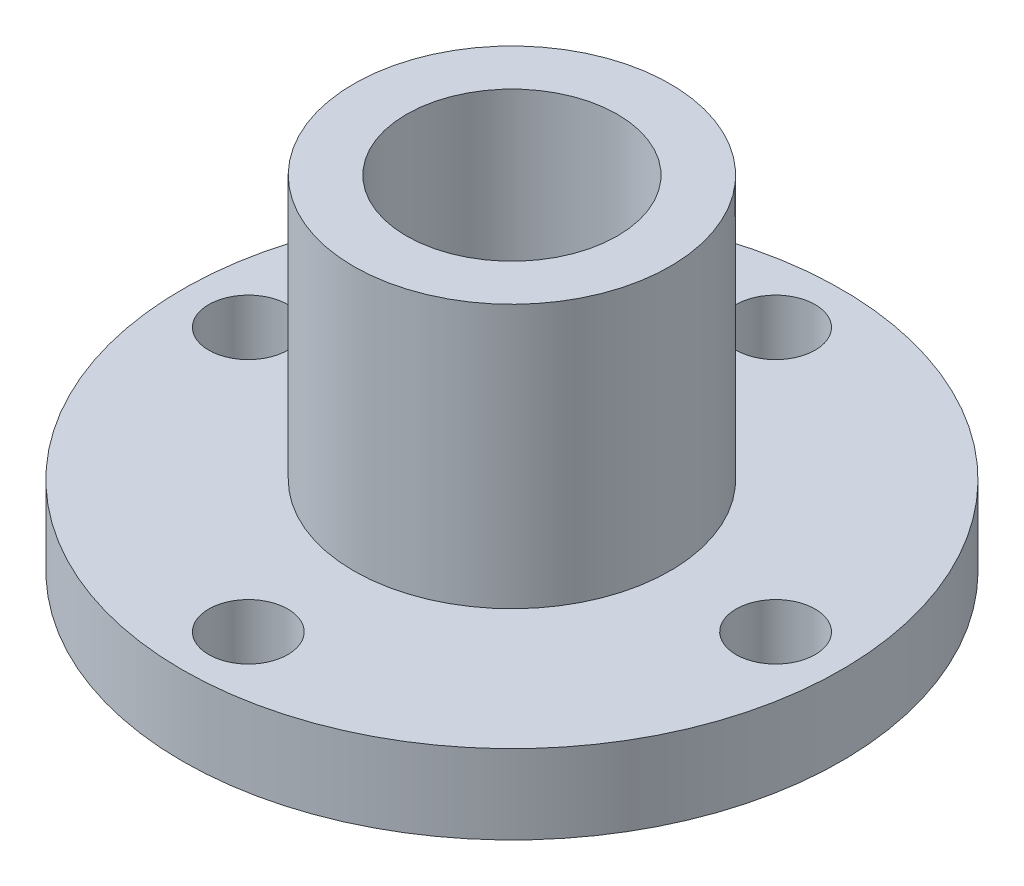
ISO-10303-21;
HEADER;
FILE_DESCRIPTION(('STEP AP214'),'2;1');
FILE_NAME('part.step','',(''),(''),'','','');
FILE_SCHEMA(('AUTOMOTIVE_DESIGN { 1 0 10303 214 1 1 1 1 }'));
ENDSEC;
DATA;
#1=APPLICATION_CONTEXT('core data for automotive mechanical design processes');
#2=APPLICATION_PROTOCOL_DEFINITION('international standard','automotive_design',2000,#1);
#3=PRODUCT_CONTEXT('',#1,'mechanical');
#4=PRODUCT('Part','Part','',(#3));
#5=PRODUCT_RELATED_PRODUCT_CATEGORY('part','',(#4));
#6=PRODUCT_DEFINITION_FORMATION('','',#4);
#7=PRODUCT_DEFINITION_CONTEXT('part definition',#1,'design');
#8=PRODUCT_DEFINITION('design','',#6,#7);
#9=PRODUCT_DEFINITION_SHAPE('','',#8);
#10=(LENGTH_UNIT() NAMED_UNIT(*) SI_UNIT(.MILLI.,.METRE.));
#11=(NAMED_UNIT(*) PLANE_ANGLE_UNIT() SI_UNIT($,.RADIAN.));
#12=(NAMED_UNIT(*) SI_UNIT($,.STERADIAN.) SOLID_ANGLE_UNIT());
#13=UNCERTAINTY_MEASURE_WITH_UNIT(LENGTH_MEASURE(1.E-05),#10,'distance_accuracy_value','');
#14=(GEOMETRIC_REPRESENTATION_CONTEXT(3) GLOBAL_UNCERTAINTY_ASSIGNED_CONTEXT((#13)) GLOBAL_UNIT_ASSIGNED_CONTEXT((#10,
#11,#12)) REPRESENTATION_CONTEXT('',''));
#15=CARTESIAN_POINT('',(0.,0.,0.));
#16=DIRECTION('',(0.,0.,1.));
#17=DIRECTION('',(1.,0.,0.));
#18=AXIS2_PLACEMENT_3D('',#15,#16,#17);
#19=CARTESIAN_POINT('',(0.,3.,0.));
#20=DIRECTION('',(0.,-1.,0.));
#21=DIRECTION('',(0.,0.,-1.));
#22=AXIS2_PLACEMENT_3D('',#19,#20,#21);
#23=CYLINDRICAL_SURFACE('',#22,12.5);
#24=CARTESIAN_POINT('',(0.,3.,0.));
#25=DIRECTION('',(0.,1.,0.));
#26=DIRECTION('',(0.,0.,1.));
#27=AXIS2_PLACEMENT_3D('',#24,#25,#26);
#28=CIRCLE('',#27,12.5);
#29=CARTESIAN_POINT('',(0.,3.,12.5));
#30=VERTEX_POINT('',#29);
#31=EDGE_CURVE('E10',#30,#30,#28,.T.);
#32=ORIENTED_EDGE('',*,*,#31,.F.);
#33=EDGE_LOOP('',(#32));
#34=FACE_BOUND('',#33,.T.);
#35=CARTESIAN_POINT('',(0.,0.,0.));
#36=DIRECTION('',(0.,1.,0.));
#37=DIRECTION('',(0.,0.,1.));
#38=AXIS2_PLACEMENT_3D('',#35,#36,#37);
#39=CIRCLE('',#38,12.5);
#40=CARTESIAN_POINT('',(0.,0.,12.5));
#41=VERTEX_POINT('',#40);
#42=EDGE_CURVE('E61',#41,#41,#39,.T.);
#43=ORIENTED_EDGE('',*,*,#42,.T.);
#44=EDGE_LOOP('',(#43));
#45=FACE_BOUND('',#44,.T.);
#46=ADVANCED_FACE('F32',(#34,#45),#23,.T.);
#47=CARTESIAN_POINT('',(0.,3.,-10.));
#48=DIRECTION('',(0.,-1.,0.));
#49=DIRECTION('',(0.,0.,-1.));
#50=AXIS2_PLACEMENT_3D('',#47,#48,#49);
#51=CYLINDRICAL_SURFACE('',#50,1.5);
#52=CARTESIAN_POINT('',(0.,3.,-10.));
#53=DIRECTION('',(0.,1.,0.));
#54=DIRECTION('',(0.,0.,1.));
#55=AXIS2_PLACEMENT_3D('',#52,#53,#54);
#56=CIRCLE('',#55,1.5);
#57=CARTESIAN_POINT('',(0.,3.,-8.5));
#58=VERTEX_POINT('',#57);
#59=EDGE_CURVE('E40',#58,#58,#56,.T.);
#60=ORIENTED_EDGE('',*,*,#59,.T.);
#61=EDGE_LOOP('',(#60));
#62=FACE_BOUND('',#61,.T.);
#63=CARTESIAN_POINT('',(0.,0.,-10.));
#64=DIRECTION('',(0.,1.,0.));
#65=DIRECTION('',(0.,0.,1.));
#66=AXIS2_PLACEMENT_3D('',#63,#64,#65);
#67=CIRCLE('',#66,1.5);
#68=CARTESIAN_POINT('',(0.,0.,-8.5));
#69=VERTEX_POINT('',#68);
#70=EDGE_CURVE('E59',#69,#69,#67,.T.);
#71=ORIENTED_EDGE('',*,*,#70,.F.);
#72=EDGE_LOOP('',(#71));
#73=FACE_BOUND('',#72,.T.);
#74=ADVANCED_FACE('F94',(#62,#73),#51,.F.);
#75=CARTESIAN_POINT('',(10.,3.,0.));
#76=DIRECTION('',(0.,-1.,0.));
#77=DIRECTION('',(0.,0.,-1.));
#78=AXIS2_PLACEMENT_3D('',#75,#76,#77);
#79=CYLINDRICAL_SURFACE('',#78,1.5);
#80=CARTESIAN_POINT('',(10.,3.,0.));
#81=DIRECTION('',(0.,1.,0.));
#82=DIRECTION('',(0.,0.,1.));
#83=AXIS2_PLACEMENT_3D('',#80,#81,#82);
#84=CIRCLE('',#83,1.5);
#85=CARTESIAN_POINT('',(10.,3.,1.5));
#86=VERTEX_POINT('',#85);
#87=EDGE_CURVE('E45',#86,#86,#84,.T.);
#88=ORIENTED_EDGE('',*,*,#87,.T.);
#89=EDGE_LOOP('',(#88));
#90=FACE_BOUND('',#89,.T.);
#91=CARTESIAN_POINT('',(10.,0.,0.));
#92=DIRECTION('',(0.,1.,0.));
#93=DIRECTION('',(0.,0.,1.));
#94=AXIS2_PLACEMENT_3D('',#91,#92,#93);
#95=CIRCLE('',#94,1.5);
#96=CARTESIAN_POINT('',(10.,0.,1.5));
#97=VERTEX_POINT('',#96);
#98=EDGE_CURVE('E56',#97,#97,#95,.T.);
#99=ORIENTED_EDGE('',*,*,#98,.F.);
#100=EDGE_LOOP('',(#99));
#101=FACE_BOUND('',#100,.T.);
#102=ADVANCED_FACE('F82',(#90,#101),#79,.F.);
#103=CARTESIAN_POINT('',(0.,3.,10.));
#104=DIRECTION('',(0.,-1.,0.));
#105=DIRECTION('',(0.,0.,-1.));
#106=AXIS2_PLACEMENT_3D('',#103,#104,#105);
#107=CYLINDRICAL_SURFACE('',#106,1.5);
#108=CARTESIAN_POINT('',(0.,3.,10.));
#109=DIRECTION('',(0.,1.,0.));
#110=DIRECTION('',(0.,0.,1.));
#111=AXIS2_PLACEMENT_3D('',#108,#109,#110);
#112=CIRCLE('',#111,1.5);
#113=CARTESIAN_POINT('',(0.,3.,11.5));
#114=VERTEX_POINT('',#113);
#115=EDGE_CURVE('E70',#114,#114,#112,.T.);
#116=ORIENTED_EDGE('',*,*,#115,.T.);
#117=EDGE_LOOP('',(#116));
#118=FACE_BOUND('',#117,.T.);
#119=CARTESIAN_POINT('',(0.,0.,10.));
#120=DIRECTION('',(0.,1.,0.));
#121=DIRECTION('',(0.,0.,1.));
#122=AXIS2_PLACEMENT_3D('',#119,#120,#121);
#123=CIRCLE('',#122,1.5);
#124=CARTESIAN_POINT('',(0.,0.,11.5));
#125=VERTEX_POINT('',#124);
#126=EDGE_CURVE('E52',#125,#125,#123,.T.);
#127=ORIENTED_EDGE('',*,*,#126,.F.);
#128=EDGE_LOOP('',(#127));
#129=FACE_BOUND('',#128,.T.);
#130=ADVANCED_FACE('F120',(#118,#129),#107,.F.);
#131=CARTESIAN_POINT('',(-10.,3.,0.));
#132=DIRECTION('',(0.,-1.,0.));
#133=DIRECTION('',(0.,0.,-1.));
#134=AXIS2_PLACEMENT_3D('',#131,#132,#133);
#135=CYLINDRICAL_SURFACE('',#134,1.5);
#136=CARTESIAN_POINT('',(-10.,3.,0.));
#137=DIRECTION('',(0.,1.,0.));
#138=DIRECTION('',(0.,0.,1.));
#139=AXIS2_PLACEMENT_3D('',#136,#137,#138);
#140=CIRCLE('',#139,1.5);
#141=CARTESIAN_POINT('',(-10.,3.,1.5));
#142=VERTEX_POINT('',#141);
#143=EDGE_CURVE('E66',#142,#142,#140,.T.);
#144=ORIENTED_EDGE('',*,*,#143,.T.);
#145=EDGE_LOOP('',(#144));
#146=FACE_BOUND('',#145,.T.);
#147=CARTESIAN_POINT('',(-10.,0.,0.));
#148=DIRECTION('',(0.,1.,0.));
#149=DIRECTION('',(0.,0.,1.));
#150=AXIS2_PLACEMENT_3D('',#147,#148,#149);
#151=CIRCLE('',#150,1.5);
#152=CARTESIAN_POINT('',(-10.,0.,1.5));
#153=VERTEX_POINT('',#152);
#154=EDGE_CURVE('E49',#153,#153,#151,.T.);
#155=ORIENTED_EDGE('',*,*,#154,.F.);
#156=EDGE_LOOP('',(#155));
#157=FACE_BOUND('',#156,.T.);
#158=ADVANCED_FACE('F34',(#146,#157),#135,.F.);
#159=CARTESIAN_POINT('',(0.,3.,0.));
#160=DIRECTION('',(0.,-1.,0.));
#161=DIRECTION('',(0.,0.,-1.));
#162=AXIS2_PLACEMENT_3D('',#159,#160,#161);
#163=CYLINDRICAL_SURFACE('',#162,4.);
#164=CARTESIAN_POINT('',(0.,0.,0.));
#165=DIRECTION('',(0.,1.,0.));
#166=DIRECTION('',(0.,0.,1.));
#167=AXIS2_PLACEMENT_3D('',#164,#165,#166);
#168=CIRCLE('',#167,4.);
#169=CARTESIAN_POINT('',(0.,0.,4.));
#170=VERTEX_POINT('',#169);
#171=EDGE_CURVE('E36',#170,#170,#168,.T.);
#172=ORIENTED_EDGE('',*,*,#171,.F.);
#173=EDGE_LOOP('',(#172));
#174=FACE_BOUND('',#173,.T.);
#175=CARTESIAN_POINT('',(0.,13.,0.));
#176=DIRECTION('',(0.,1.,0.));
#177=DIRECTION('',(0.,0.,1.));
#178=AXIS2_PLACEMENT_3D('',#175,#176,#177);
#179=CIRCLE('',#178,4.);
#180=CARTESIAN_POINT('',(0.,13.,4.));
#181=VERTEX_POINT('',#180);
#182=EDGE_CURVE('E143',#181,#181,#179,.T.);
#183=ORIENTED_EDGE('',*,*,#182,.T.);
#184=EDGE_LOOP('',(#183));
#185=FACE_BOUND('',#184,.T.);
#186=ADVANCED_FACE('F89',(#174,#185),#163,.F.);
#187=CARTESIAN_POINT('',(0.,3.,0.));
#188=DIRECTION('',(0.,1.,0.));
#189=DIRECTION('',(0.,0.,1.));
#190=AXIS2_PLACEMENT_3D('',#187,#188,#189);
#191=PLANE('',#190);
#192=CARTESIAN_POINT('',(0.,3.,0.));
#193=DIRECTION('',(0.,1.,0.));
#194=DIRECTION('',(0.,0.,1.));
#195=AXIS2_PLACEMENT_3D('',#192,#193,#194);
#196=CIRCLE('',#195,6.);
#197=CARTESIAN_POINT('',(0.,3.,6.));
#198=VERTEX_POINT('',#197);
#199=EDGE_CURVE('E77',#198,#198,#196,.T.);
#200=ORIENTED_EDGE('',*,*,#199,.F.);
#201=EDGE_LOOP('',(#200));
#202=FACE_BOUND('',#201,.T.);
#203=ORIENTED_EDGE('',*,*,#143,.F.);
#204=EDGE_LOOP('',(#203));
#205=FACE_BOUND('',#204,.T.);
#206=ORIENTED_EDGE('',*,*,#115,.F.);
#207=EDGE_LOOP('',(#206));
#208=FACE_BOUND('',#207,.T.);
#209=ORIENTED_EDGE('',*,*,#87,.F.);
#210=EDGE_LOOP('',(#209));
#211=FACE_BOUND('',#210,.T.);
#212=ORIENTED_EDGE('',*,*,#59,.F.);
#213=EDGE_LOOP('',(#212));
#214=FACE_BOUND('',#213,.T.);
#215=ORIENTED_EDGE('',*,*,#31,.T.);
#216=EDGE_LOOP('',(#215));
#217=FACE_BOUND('',#216,.T.);
#218=ADVANCED_FACE('F85',(#202,#205,#208,#211,#214,#217),#191,.T.);
#219=CARTESIAN_POINT('',(0.,0.,0.));
#220=DIRECTION('',(0.,1.,0.));
#221=DIRECTION('',(0.,0.,1.));
#222=AXIS2_PLACEMENT_3D('',#219,#220,#221);
#223=PLANE('',#222);
#224=ORIENTED_EDGE('',*,*,#154,.T.);
#225=EDGE_LOOP('',(#224));
#226=FACE_BOUND('',#225,.T.);
#227=ORIENTED_EDGE('',*,*,#126,.T.);
#228=EDGE_LOOP('',(#227));
#229=FACE_BOUND('',#228,.T.);
#230=ORIENTED_EDGE('',*,*,#98,.T.);
#231=EDGE_LOOP('',(#230));
#232=FACE_BOUND('',#231,.T.);
#233=ORIENTED_EDGE('',*,*,#70,.T.);
#234=EDGE_LOOP('',(#233));
#235=FACE_BOUND('',#234,.T.);
#236=ORIENTED_EDGE('',*,*,#42,.F.);
#237=EDGE_LOOP('',(#236));
#238=FACE_BOUND('',#237,.T.);
#239=ORIENTED_EDGE('',*,*,#171,.T.);
#240=EDGE_LOOP('',(#239));
#241=FACE_BOUND('',#240,.T.);
#242=ADVANCED_FACE('F88',(#226,#229,#232,#235,#238,#241),#223,.F.);
#243=CARTESIAN_POINT('',(0.,13.,0.));
#244=DIRECTION('',(0.,-1.,0.));
#245=DIRECTION('',(0.,0.,-1.));
#246=AXIS2_PLACEMENT_3D('',#243,#244,#245);
#247=CYLINDRICAL_SURFACE('',#246,6.);
#248=CARTESIAN_POINT('',(0.,13.,0.));
#249=DIRECTION('',(0.,1.,0.));
#250=DIRECTION('',(0.,0.,1.));
#251=AXIS2_PLACEMENT_3D('',#248,#249,#250);
#252=CIRCLE('',#251,6.);
#253=CARTESIAN_POINT('',(0.,13.,6.));
#254=VERTEX_POINT('',#253);
#255=EDGE_CURVE('E53',#254,#254,#252,.T.);
#256=ORIENTED_EDGE('',*,*,#255,.F.);
#257=EDGE_LOOP('',(#256));
#258=FACE_BOUND('',#257,.T.);
#259=ORIENTED_EDGE('',*,*,#199,.T.);
#260=EDGE_LOOP('',(#259));
#261=FACE_BOUND('',#260,.T.);
#262=ADVANCED_FACE('F102',(#258,#261),#247,.T.);
#263=CARTESIAN_POINT('',(0.,13.,0.));
#264=DIRECTION('',(0.,1.,0.));
#265=DIRECTION('',(0.,0.,1.));
#266=AXIS2_PLACEMENT_3D('',#263,#264,#265);
#267=PLANE('',#266);
#268=ORIENTED_EDGE('',*,*,#182,.F.);
#269=EDGE_LOOP('',(#268));
#270=FACE_BOUND('',#269,.T.);
#271=ORIENTED_EDGE('',*,*,#255,.T.);
#272=EDGE_LOOP('',(#271));
#273=FACE_BOUND('',#272,.T.);
#274=ADVANCED_FACE('F108',(#270,#273),#267,.T.);
#275=CLOSED_SHELL('',(#46,#74,#102,#130,#158,#186,#218,#242,#262,#274));
#276=MANIFOLD_SOLID_BREP('B2',#275);
#277=ADVANCED_BREP_SHAPE_REPRESENTATION('',(#18,#276),#14);
#278=SHAPE_DEFINITION_REPRESENTATION(#9,#277);
ENDSEC;
END-ISO-10303-21;
